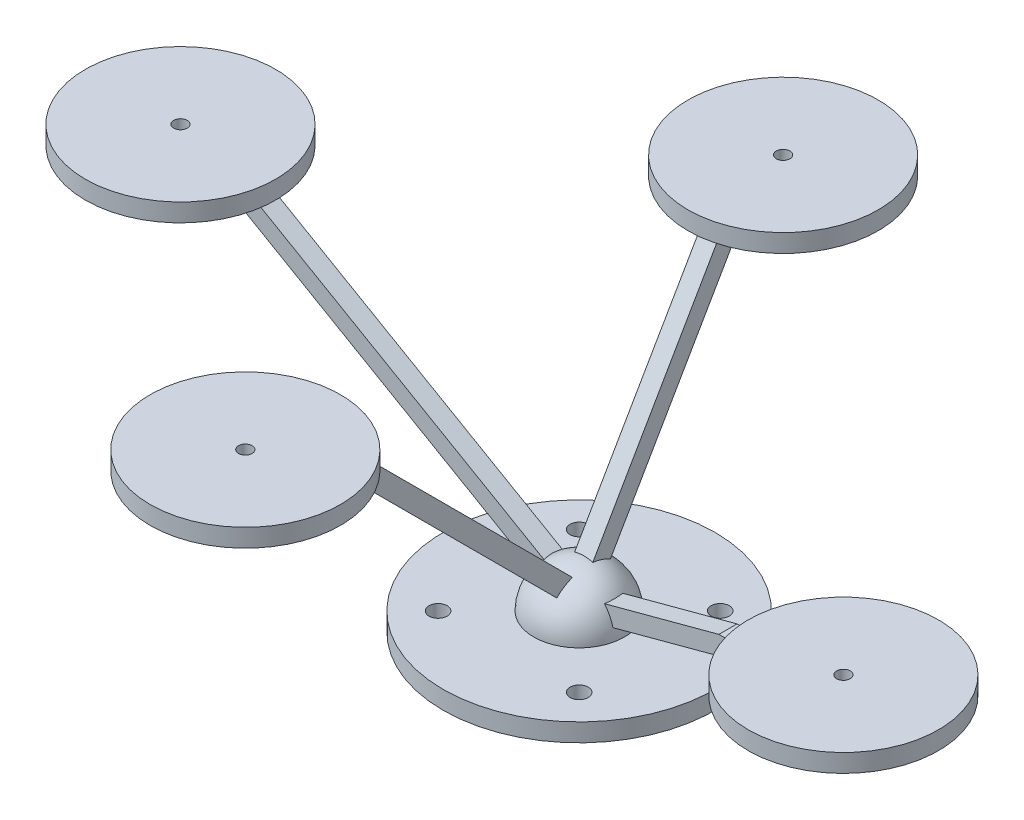
ISO-10303-21;
HEADER;
FILE_DESCRIPTION(('STEP AP214'),'2;1');
FILE_NAME('part.step','',(''),(''),'','','');
FILE_SCHEMA(('AUTOMOTIVE_DESIGN { 1 0 10303 214 1 1 1 1 }'));
ENDSEC;
DATA;
#1=APPLICATION_CONTEXT('core data for automotive mechanical design processes');
#2=APPLICATION_PROTOCOL_DEFINITION('international standard','automotive_design',2000,#1);
#3=PRODUCT_CONTEXT('',#1,'mechanical');
#4=PRODUCT('Part','Part','',(#3));
#5=PRODUCT_RELATED_PRODUCT_CATEGORY('part','',(#4));
#6=PRODUCT_DEFINITION_FORMATION('','',#4);
#7=PRODUCT_DEFINITION_CONTEXT('part definition',#1,'design');
#8=PRODUCT_DEFINITION('design','',#6,#7);
#9=PRODUCT_DEFINITION_SHAPE('','',#8);
#10=(LENGTH_UNIT() NAMED_UNIT(*) SI_UNIT(.MILLI.,.METRE.));
#11=(NAMED_UNIT(*) PLANE_ANGLE_UNIT() SI_UNIT($,.RADIAN.));
#12=(NAMED_UNIT(*) SI_UNIT($,.STERADIAN.) SOLID_ANGLE_UNIT());
#13=UNCERTAINTY_MEASURE_WITH_UNIT(LENGTH_MEASURE(1.E-05),#10,'distance_accuracy_value','');
#14=(GEOMETRIC_REPRESENTATION_CONTEXT(3) GLOBAL_UNCERTAINTY_ASSIGNED_CONTEXT((#13)) GLOBAL_UNIT_ASSIGNED_CONTEXT((#10,
#11,#12)) REPRESENTATION_CONTEXT('',''));
#15=CARTESIAN_POINT('',(0.,0.,0.));
#16=DIRECTION('',(0.,0.,1.));
#17=DIRECTION('',(1.,0.,0.));
#18=AXIS2_PLACEMENT_3D('',#15,#16,#17);
#19=CARTESIAN_POINT('',(0.,2.,0.));
#20=DIRECTION('',(0.,-1.,0.));
#21=DIRECTION('',(0.,0.,-1.));
#22=AXIS2_PLACEMENT_3D('',#19,#20,#21);
#23=SPHERICAL_SURFACE('',#22,5.);
#24=CARTESIAN_POINT('',(0.,2.,1.));
#25=DIRECTION('',(0.,0.,1.));
#26=DIRECTION('',(1.,0.,0.));
#27=AXIS2_PLACEMENT_3D('',#24,#25,#26);
#28=CIRCLE('',#27,4.89897948556636);
#29=CARTESIAN_POINT('',(-4.24264068711928,4.44948974278318,1.));
#30=VERTEX_POINT('',#29);
#31=CARTESIAN_POINT('',(-2.87298334620741,5.96811878506867,1.));
#32=VERTEX_POINT('',#31);
#33=EDGE_CURVE('E349',#30,#32,#28,.F.);
#34=ORIENTED_EDGE('',*,*,#33,.F.);
#35=CARTESIAN_POINT('',(0.,2.,0.));
#36=DIRECTION('',(0.500000000000001,0.866025403784438,0.));
#37=DIRECTION('',(-0.866025403784438,0.500000000000001,0.));
#38=AXIS2_PLACEMENT_3D('',#35,#36,#37);
#39=CIRCLE('',#38,5.);
#40=CARTESIAN_POINT('',(-4.24264068711928,4.44948974278318,-1.));
#41=VERTEX_POINT('',#40);
#42=EDGE_CURVE('E354',#30,#41,#39,.F.);
#43=ORIENTED_EDGE('',*,*,#42,.T.);
#44=CARTESIAN_POINT('',(0.,2.,-1.));
#45=DIRECTION('',(0.,0.,1.));
#46=DIRECTION('',(1.,0.,0.));
#47=AXIS2_PLACEMENT_3D('',#44,#45,#46);
#48=CIRCLE('',#47,4.89897948556636);
#49=CARTESIAN_POINT('',(-2.87298334620741,5.96811878506867,-1.));
#50=VERTEX_POINT('',#49);
#51=EDGE_CURVE('E338',#41,#50,#48,.F.);
#52=ORIENTED_EDGE('',*,*,#51,.T.);
#53=CARTESIAN_POINT('',(1.00000000000001,3.73205080756888,0.));
#54=DIRECTION('',(-0.500000000000001,-0.866025403784438,0.));
#55=DIRECTION('',(0.866025403784438,-0.500000000000001,0.));
#56=AXIS2_PLACEMENT_3D('',#53,#54,#55);
#57=CIRCLE('',#56,4.58257569495584);
#58=EDGE_CURVE('E350',#50,#32,#57,.F.);
#59=ORIENTED_EDGE('',*,*,#58,.T.);
#60=EDGE_LOOP('',(#34,#43,#52,#59));
#61=FACE_BOUND('',#60,.T.);
#62=CARTESIAN_POINT('',(3.802113527405,5.08932561001975,1.));
#63=VERTEX_POINT('',#62);
#64=CARTESIAN_POINT('',(4.73205080756889,3.26794919243109,1.));
#65=VERTEX_POINT('',#64);
#66=EDGE_CURVE('E346',#63,#65,#28,.F.);
#67=ORIENTED_EDGE('',*,*,#66,.F.);
#68=CARTESIAN_POINT('',(-0.517638090205028,3.93185165257814,0.));
#69=DIRECTION('',(0.258819045102515,-0.96592582628907,0.));
#70=DIRECTION('',(0.96592582628907,0.258819045102515,0.));
#71=AXIS2_PLACEMENT_3D('',#68,#69,#70);
#72=CIRCLE('',#71,4.58257569495584);
#73=CARTESIAN_POINT('',(3.802113527405,5.08932561001975,-1.));
#74=VERTEX_POINT('',#73);
#75=EDGE_CURVE('E337',#63,#74,#72,.F.);
#76=ORIENTED_EDGE('',*,*,#75,.T.);
#77=CARTESIAN_POINT('',(4.73205080756889,3.26794919243109,-1.));
#78=VERTEX_POINT('',#77);
#79=EDGE_CURVE('E333',#74,#78,#48,.F.);
#80=ORIENTED_EDGE('',*,*,#79,.T.);
#81=CARTESIAN_POINT('',(0.,2.,0.));
#82=DIRECTION('',(-0.258819045102514,0.96592582628907,0.));
#83=DIRECTION('',(-0.96592582628907,-0.258819045102514,0.));
#84=AXIS2_PLACEMENT_3D('',#81,#82,#83);
#85=CIRCLE('',#84,5.);
#86=EDGE_CURVE('E342',#78,#65,#85,.F.);
#87=ORIENTED_EDGE('',*,*,#86,.T.);
#88=EDGE_LOOP('',(#67,#76,#80,#87));
#89=FACE_BOUND('',#88,.T.);
#90=CARTESIAN_POINT('',(0.,2.,0.));
#91=DIRECTION('',(0.,1.,0.));
#92=DIRECTION('',(0.,0.,1.));
#93=AXIS2_PLACEMENT_3D('',#90,#91,#92);
#94=CIRCLE('',#93,5.);
#95=CARTESIAN_POINT('',(0.,2.,5.));
#96=VERTEX_POINT('',#95);
#97=EDGE_CURVE('E326',#96,#96,#94,.T.);
#98=ORIENTED_EDGE('',*,*,#97,.T.);
#99=EDGE_LOOP('',(#98));
#100=FACE_BOUND('',#99,.T.);
#101=CARTESIAN_POINT('',(0.,3.41421356237309,-1.4142135623731));
#102=DIRECTION('',(0.,-0.707106781186546,0.707106781186549));
#103=DIRECTION('',(0.,-0.707106781186549,-0.707106781186546));
#104=AXIS2_PLACEMENT_3D('',#101,#102,#103);
#105=CIRCLE('',#104,4.58257569495584);
#106=CARTESIAN_POINT('',(-1.,6.57649122254148,1.74806409779528));
#107=VERTEX_POINT('',#106);
#108=CARTESIAN_POINT('',(1.,6.57649122254148,1.74806409779528));
#109=VERTEX_POINT('',#108);
#110=EDGE_CURVE('E177',#107,#109,#105,.F.);
#111=ORIENTED_EDGE('',*,*,#110,.T.);
#112=CARTESIAN_POINT('',(1.,2.,0.));
#113=DIRECTION('',(-1.,0.,0.));
#114=DIRECTION('',(0.,0.,1.));
#115=AXIS2_PLACEMENT_3D('',#112,#113,#114);
#116=CIRCLE('',#115,4.89897948556636);
#117=CARTESIAN_POINT('',(1.,5.46410161513776,3.46410161513775));
#118=VERTEX_POINT('',#117);
#119=EDGE_CURVE('E50',#109,#118,#116,.F.);
#120=ORIENTED_EDGE('',*,*,#119,.T.);
#121=CARTESIAN_POINT('',(0.,2.,0.));
#122=DIRECTION('',(0.,0.707106781186546,-0.707106781186549));
#123=DIRECTION('',(0.,0.707106781186549,0.707106781186546));
#124=AXIS2_PLACEMENT_3D('',#121,#122,#123);
#125=CIRCLE('',#124,5.);
#126=CARTESIAN_POINT('',(-1.,5.46410161513776,3.46410161513775));
#127=VERTEX_POINT('',#126);
#128=EDGE_CURVE('E364',#118,#127,#125,.F.);
#129=ORIENTED_EDGE('',*,*,#128,.T.);
#130=CARTESIAN_POINT('',(-1.,2.,0.));
#131=DIRECTION('',(-1.,0.,0.));
#132=DIRECTION('',(0.,0.,1.));
#133=AXIS2_PLACEMENT_3D('',#130,#131,#132);
#134=CIRCLE('',#133,4.89897948556636);
#135=EDGE_CURVE('E358',#107,#127,#134,.F.);
#136=ORIENTED_EDGE('',*,*,#135,.F.);
#137=EDGE_LOOP('',(#111,#120,#129,#136));
#138=FACE_BOUND('',#137,.T.);
#139=CARTESIAN_POINT('',(0.,2.,0.));
#140=DIRECTION('',(0.,0.500000000000004,0.866025403784436));
#141=DIRECTION('',(0.,-0.866025403784436,0.500000000000004));
#142=AXIS2_PLACEMENT_3D('',#139,#140,#141);
#143=CIRCLE('',#142,5.);
#144=CARTESIAN_POINT('',(-1.,6.24264068711927,-2.4494897427832));
#145=VERTEX_POINT('',#144);
#146=CARTESIAN_POINT('',(1.,6.24264068711927,-2.4494897427832));
#147=VERTEX_POINT('',#146);
#148=EDGE_CURVE('E43',#145,#147,#143,.F.);
#149=ORIENTED_EDGE('',*,*,#148,.T.);
#150=CARTESIAN_POINT('',(1.,6.87298334620741,-0.504017169930936));
#151=VERTEX_POINT('',#150);
#152=EDGE_CURVE('E11',#147,#151,#116,.F.);
#153=ORIENTED_EDGE('',*,*,#152,.T.);
#154=CARTESIAN_POINT('',(0.,3.00000000000001,1.73205080756887));
#155=DIRECTION('',(0.,-0.500000000000004,-0.866025403784436));
#156=DIRECTION('',(0.,0.866025403784436,-0.500000000000004));
#157=AXIS2_PLACEMENT_3D('',#154,#155,#156);
#158=CIRCLE('',#157,4.58257569495584);
#159=CARTESIAN_POINT('',(-1.,6.87298334620742,-0.504017169930936));
#160=VERTEX_POINT('',#159);
#161=EDGE_CURVE('E367',#151,#160,#158,.F.);
#162=ORIENTED_EDGE('',*,*,#161,.T.);
#163=EDGE_CURVE('E361',#145,#160,#134,.F.);
#164=ORIENTED_EDGE('',*,*,#163,.F.);
#165=EDGE_LOOP('',(#149,#153,#162,#164));
#166=FACE_BOUND('',#165,.T.);
#167=ADVANCED_FACE('F39',(#61,#89,#100,#138,#166),#23,.T.);
#168=CARTESIAN_POINT('',(0.,2.,0.));
#169=DIRECTION('',(0.,1.,0.));
#170=DIRECTION('',(0.,0.,1.));
#171=AXIS2_PLACEMENT_3D('',#168,#169,#170);
#172=PLANE('',#171);
#173=ORIENTED_EDGE('',*,*,#97,.F.);
#174=EDGE_LOOP('',(#173));
#175=FACE_BOUND('',#174,.T.);
#176=CARTESIAN_POINT('',(-7.77817459305207,2.,7.77817459305198));
#177=DIRECTION('',(0.,1.,0.));
#178=DIRECTION('',(0.,0.,1.));
#179=AXIS2_PLACEMENT_3D('',#176,#177,#178);
#180=CIRCLE('',#179,1.);
#181=CARTESIAN_POINT('',(-7.77817459305207,2.,8.77817459305198));
#182=VERTEX_POINT('',#181);
#183=EDGE_CURVE('E298',#182,#182,#180,.T.);
#184=ORIENTED_EDGE('',*,*,#183,.F.);
#185=EDGE_LOOP('',(#184));
#186=FACE_BOUND('',#185,.T.);
#187=CARTESIAN_POINT('',(7.77817459305206,2.,-7.77817459305199));
#188=DIRECTION('',(0.,1.,0.));
#189=DIRECTION('',(0.,0.,1.));
#190=AXIS2_PLACEMENT_3D('',#187,#188,#189);
#191=CIRCLE('',#190,1.);
#192=CARTESIAN_POINT('',(7.77817459305206,2.,-6.77817459305198));
#193=VERTEX_POINT('',#192);
#194=EDGE_CURVE('E314',#193,#193,#191,.T.);
#195=ORIENTED_EDGE('',*,*,#194,.F.);
#196=EDGE_LOOP('',(#195));
#197=FACE_BOUND('',#196,.T.);
#198=CARTESIAN_POINT('',(0.,2.,0.));
#199=DIRECTION('',(0.,1.,0.));
#200=DIRECTION('',(0.,0.,1.));
#201=AXIS2_PLACEMENT_3D('',#198,#199,#200);
#202=CIRCLE('',#201,15.);
#203=CARTESIAN_POINT('',(0.,2.,15.));
#204=VERTEX_POINT('',#203);
#205=EDGE_CURVE('E322',#204,#204,#202,.T.);
#206=ORIENTED_EDGE('',*,*,#205,.T.);
#207=EDGE_LOOP('',(#206));
#208=FACE_BOUND('',#207,.T.);
#209=CARTESIAN_POINT('',(-7.77817459305204,2.,-7.77817459305201));
#210=DIRECTION('',(0.,1.,0.));
#211=DIRECTION('',(0.,0.,1.));
#212=AXIS2_PLACEMENT_3D('',#209,#210,#211);
#213=CIRCLE('',#212,0.999999999999995);
#214=CARTESIAN_POINT('',(-7.77817459305204,2.,-6.77817459305201));
#215=VERTEX_POINT('',#214);
#216=EDGE_CURVE('E306',#215,#215,#213,.T.);
#217=ORIENTED_EDGE('',*,*,#216,.F.);
#218=EDGE_LOOP('',(#217));
#219=FACE_BOUND('',#218,.T.);
#220=CARTESIAN_POINT('',(7.77817459305204,2.,7.77817459305201));
#221=DIRECTION('',(0.,1.,0.));
#222=DIRECTION('',(0.,0.,1.));
#223=AXIS2_PLACEMENT_3D('',#220,#221,#222);
#224=CIRCLE('',#223,1.);
#225=CARTESIAN_POINT('',(7.77817459305204,2.,8.77817459305201));
#226=VERTEX_POINT('',#225);
#227=EDGE_CURVE('E290',#226,#226,#224,.T.);
#228=ORIENTED_EDGE('',*,*,#227,.F.);
#229=EDGE_LOOP('',(#228));
#230=FACE_BOUND('',#229,.T.);
#231=ADVANCED_FACE('F464',(#175,#186,#197,#208,#219,#230),#172,.T.);
#232=CARTESIAN_POINT('',(0.,0.,0.));
#233=DIRECTION('',(0.,1.,0.));
#234=DIRECTION('',(0.,0.,1.));
#235=AXIS2_PLACEMENT_3D('',#232,#233,#234);
#236=PLANE('',#235);
#237=CARTESIAN_POINT('',(0.,0.,0.));
#238=DIRECTION('',(0.,1.,0.));
#239=DIRECTION('',(0.,0.,1.));
#240=AXIS2_PLACEMENT_3D('',#237,#238,#239);
#241=CIRCLE('',#240,15.);
#242=CARTESIAN_POINT('',(0.,0.,15.));
#243=VERTEX_POINT('',#242);
#244=EDGE_CURVE('E318',#243,#243,#241,.T.);
#245=ORIENTED_EDGE('',*,*,#244,.F.);
#246=EDGE_LOOP('',(#245));
#247=FACE_BOUND('',#246,.T.);
#248=CARTESIAN_POINT('',(7.77817459305206,0.,-7.77817459305199));
#249=DIRECTION('',(0.,1.,0.));
#250=DIRECTION('',(0.,0.,1.));
#251=AXIS2_PLACEMENT_3D('',#248,#249,#250);
#252=CIRCLE('',#251,1.);
#253=CARTESIAN_POINT('',(7.77817459305206,0.,-6.77817459305198));
#254=VERTEX_POINT('',#253);
#255=EDGE_CURVE('E310',#254,#254,#252,.T.);
#256=ORIENTED_EDGE('',*,*,#255,.T.);
#257=EDGE_LOOP('',(#256));
#258=FACE_BOUND('',#257,.T.);
#259=CARTESIAN_POINT('',(-7.77817459305204,0.,-7.77817459305201));
#260=DIRECTION('',(0.,1.,0.));
#261=DIRECTION('',(0.,0.,1.));
#262=AXIS2_PLACEMENT_3D('',#259,#260,#261);
#263=CIRCLE('',#262,0.999999999999995);
#264=CARTESIAN_POINT('',(-7.77817459305204,0.,-6.77817459305201));
#265=VERTEX_POINT('',#264);
#266=EDGE_CURVE('E302',#265,#265,#263,.T.);
#267=ORIENTED_EDGE('',*,*,#266,.T.);
#268=EDGE_LOOP('',(#267));
#269=FACE_BOUND('',#268,.T.);
#270=CARTESIAN_POINT('',(-7.77817459305207,0.,7.77817459305198));
#271=DIRECTION('',(0.,1.,0.));
#272=DIRECTION('',(0.,0.,1.));
#273=AXIS2_PLACEMENT_3D('',#270,#271,#272);
#274=CIRCLE('',#273,1.);
#275=CARTESIAN_POINT('',(-7.77817459305207,0.,8.77817459305198));
#276=VERTEX_POINT('',#275);
#277=EDGE_CURVE('E294',#276,#276,#274,.T.);
#278=ORIENTED_EDGE('',*,*,#277,.T.);
#279=EDGE_LOOP('',(#278));
#280=FACE_BOUND('',#279,.T.);
#281=CARTESIAN_POINT('',(7.77817459305204,0.,7.77817459305201));
#282=DIRECTION('',(0.,1.,0.));
#283=DIRECTION('',(0.,0.,1.));
#284=AXIS2_PLACEMENT_3D('',#281,#282,#283);
#285=CIRCLE('',#284,1.);
#286=CARTESIAN_POINT('',(7.77817459305204,0.,8.77817459305201));
#287=VERTEX_POINT('',#286);
#288=EDGE_CURVE('E289',#287,#287,#285,.T.);
#289=ORIENTED_EDGE('',*,*,#288,.T.);
#290=EDGE_LOOP('',(#289));
#291=FACE_BOUND('',#290,.T.);
#292=ADVANCED_FACE('F472',(#247,#258,#269,#280,#291),#236,.F.);
#293=CARTESIAN_POINT('',(0.,2.,0.));
#294=DIRECTION('',(0.,-1.,0.));
#295=DIRECTION('',(0.,0.,-1.));
#296=AXIS2_PLACEMENT_3D('',#293,#294,#295);
#297=CYLINDRICAL_SURFACE('',#296,15.);
#298=ORIENTED_EDGE('',*,*,#205,.F.);
#299=EDGE_LOOP('',(#298));
#300=FACE_BOUND('',#299,.T.);
#301=ORIENTED_EDGE('',*,*,#244,.T.);
#302=EDGE_LOOP('',(#301));
#303=FACE_BOUND('',#302,.T.);
#304=ADVANCED_FACE('F41',(#300,#303),#297,.T.);
#305=CARTESIAN_POINT('',(7.77817459305206,2.,-7.77817459305199));
#306=DIRECTION('',(0.,-1.,0.));
#307=DIRECTION('',(0.,0.,-1.));
#308=AXIS2_PLACEMENT_3D('',#305,#306,#307);
#309=CYLINDRICAL_SURFACE('',#308,1.);
#310=ORIENTED_EDGE('',*,*,#194,.T.);
#311=EDGE_LOOP('',(#310));
#312=FACE_BOUND('',#311,.T.);
#313=ORIENTED_EDGE('',*,*,#255,.F.);
#314=EDGE_LOOP('',(#313));
#315=FACE_BOUND('',#314,.T.);
#316=ADVANCED_FACE('F493',(#312,#315),#309,.F.);
#317=CARTESIAN_POINT('',(-7.77817459305204,2.,-7.77817459305201));
#318=DIRECTION('',(0.,-1.,0.));
#319=DIRECTION('',(0.,0.,-1.));
#320=AXIS2_PLACEMENT_3D('',#317,#318,#319);
#321=CYLINDRICAL_SURFACE('',#320,0.999999999999995);
#322=ORIENTED_EDGE('',*,*,#216,.T.);
#323=EDGE_LOOP('',(#322));
#324=FACE_BOUND('',#323,.T.);
#325=ORIENTED_EDGE('',*,*,#266,.F.);
#326=EDGE_LOOP('',(#325));
#327=FACE_BOUND('',#326,.T.);
#328=ADVANCED_FACE('F489',(#324,#327),#321,.F.);
#329=CARTESIAN_POINT('',(-7.77817459305207,2.,7.77817459305198));
#330=DIRECTION('',(0.,-1.,0.));
#331=DIRECTION('',(0.,0.,-1.));
#332=AXIS2_PLACEMENT_3D('',#329,#330,#331);
#333=CYLINDRICAL_SURFACE('',#332,1.);
#334=ORIENTED_EDGE('',*,*,#183,.T.);
#335=EDGE_LOOP('',(#334));
#336=FACE_BOUND('',#335,.T.);
#337=ORIENTED_EDGE('',*,*,#277,.F.);
#338=EDGE_LOOP('',(#337));
#339=FACE_BOUND('',#338,.T.);
#340=ADVANCED_FACE('F485',(#336,#339),#333,.F.);
#341=CARTESIAN_POINT('',(7.77817459305204,2.,7.77817459305201));
#342=DIRECTION('',(0.,-1.,0.));
#343=DIRECTION('',(0.,0.,-1.));
#344=AXIS2_PLACEMENT_3D('',#341,#342,#343);
#345=CYLINDRICAL_SURFACE('',#344,1.);
#346=ORIENTED_EDGE('',*,*,#227,.T.);
#347=EDGE_LOOP('',(#346));
#348=FACE_BOUND('',#347,.T.);
#349=ORIENTED_EDGE('',*,*,#288,.F.);
#350=EDGE_LOOP('',(#349));
#351=FACE_BOUND('',#350,.T.);
#352=ADVANCED_FACE('F481',(#348,#351),#345,.F.);
#353=CARTESIAN_POINT('',(16.420739046914,8.47047612756286,1.));
#354=DIRECTION('',(0.,-1.,0.));
#355=DIRECTION('',(1.,0.,0.));
#356=AXIS2_PLACEMENT_3D('',#353,#354,#355);
#357=PLANE('',#356);
#358=CARTESIAN_POINT('',(29.1481456572267,8.47047612756286,0.));
#359=DIRECTION('',(0.,1.,0.));
#360=DIRECTION('',(0.,0.,1.));
#361=AXIS2_PLACEMENT_3D('',#358,#359,#360);
#362=CIRCLE('',#361,10.5);
#363=CARTESIAN_POINT('',(18.6958731770433,8.47047612756285,-1.));
#364=VERTEX_POINT('',#363);
#365=CARTESIAN_POINT('',(18.6958731770433,8.47047612756286,1.));
#366=VERTEX_POINT('',#365);
#367=EDGE_CURVE('E226',#364,#366,#362,.T.);
#368=ORIENTED_EDGE('',*,*,#367,.F.);
#369=DIRECTION('',(-1.,0.,0.));
#370=VECTOR('',#369,1.);
#371=CARTESIAN_POINT('',(16.420739046914,8.47047612756286,-1.));
#372=LINE('',#371,#370);
#373=CARTESIAN_POINT('',(16.420739046914,8.47047612756286,-1.));
#374=VERTEX_POINT('',#373);
#375=EDGE_CURVE('E259',#364,#374,#372,.T.);
#376=ORIENTED_EDGE('',*,*,#375,.T.);
#377=DIRECTION('',(0.,0.,-1.));
#378=VECTOR('',#377,1.);
#379=CARTESIAN_POINT('',(16.420739046914,8.47047612756286,1.));
#380=LINE('',#379,#378);
#381=CARTESIAN_POINT('',(16.420739046914,8.47047612756286,1.));
#382=VERTEX_POINT('',#381);
#383=EDGE_CURVE('E281',#382,#374,#380,.T.);
#384=ORIENTED_EDGE('',*,*,#383,.F.);
#385=DIRECTION('',(-1.,0.,0.));
#386=VECTOR('',#385,1.);
#387=CARTESIAN_POINT('',(16.420739046914,8.47047612756286,1.));
#388=LINE('',#387,#386);
#389=EDGE_CURVE('E238',#366,#382,#388,.T.);
#390=ORIENTED_EDGE('',*,*,#389,.F.);
#391=EDGE_LOOP('',(#368,#376,#384,#390));
#392=FACE_BOUND('',#391,.T.);
#393=ADVANCED_FACE('F484',(#392),#357,.F.);
#394=CARTESIAN_POINT('',(0.,0.,-1.));
#395=DIRECTION('',(0.,0.,1.));
#396=DIRECTION('',(1.,0.,0.));
#397=AXIS2_PLACEMENT_3D('',#394,#395,#396);
#398=PLANE('',#397);
#399=ORIENTED_EDGE('',*,*,#79,.F.);
#400=DIRECTION('',(-0.96592582628907,-0.258819045102515,0.));
#401=VECTOR('',#400,1.);
#402=CARTESIAN_POINT('',(0.,4.07055236082016,-1.));
#403=LINE('',#402,#401);
#404=EDGE_CURVE('E264',#374,#74,#403,.T.);
#405=ORIENTED_EDGE('',*,*,#404,.F.);
#406=ORIENTED_EDGE('',*,*,#375,.F.);
#407=CARTESIAN_POINT('',(24.1481456572267,8.47047612756286,-1.));
#408=VERTEX_POINT('',#407);
#409=EDGE_CURVE('E260',#408,#364,#372,.T.);
#410=ORIENTED_EDGE('',*,*,#409,.F.);
#411=DIRECTION('',(0.96592582628907,0.258819045102514,0.));
#412=VECTOR('',#411,1.);
#413=CARTESIAN_POINT('',(0.,2.,-1.));
#414=LINE('',#413,#412);
#415=EDGE_CURVE('E256',#78,#408,#414,.T.);
#416=ORIENTED_EDGE('',*,*,#415,.F.);
#417=EDGE_LOOP('',(#399,#405,#406,#410,#416));
#418=FACE_BOUND('',#417,.T.);
#419=ADVANCED_FACE('F554',(#418),#398,.F.);
#420=CARTESIAN_POINT('',(0.,0.,1.));
#421=DIRECTION('',(0.,0.,1.));
#422=DIRECTION('',(1.,0.,0.));
#423=AXIS2_PLACEMENT_3D('',#420,#421,#422);
#424=PLANE('',#423);
#425=DIRECTION('',(-0.96592582628907,-0.258819045102515,0.));
#426=VECTOR('',#425,1.);
#427=CARTESIAN_POINT('',(0.,4.07055236082016,1.));
#428=LINE('',#427,#426);
#429=EDGE_CURVE('E242',#382,#63,#428,.T.);
#430=ORIENTED_EDGE('',*,*,#429,.T.);
#431=ORIENTED_EDGE('',*,*,#66,.T.);
#432=DIRECTION('',(0.96592582628907,0.258819045102514,0.));
#433=VECTOR('',#432,1.);
#434=CARTESIAN_POINT('',(0.,2.,1.));
#435=LINE('',#434,#433);
#436=CARTESIAN_POINT('',(24.1481456572267,8.47047612756286,1.));
#437=VERTEX_POINT('',#436);
#438=EDGE_CURVE('E234',#65,#437,#435,.T.);
#439=ORIENTED_EDGE('',*,*,#438,.T.);
#440=EDGE_CURVE('E239',#437,#366,#388,.T.);
#441=ORIENTED_EDGE('',*,*,#440,.T.);
#442=ORIENTED_EDGE('',*,*,#389,.T.);
#443=EDGE_LOOP('',(#430,#431,#439,#441,#442));
#444=FACE_BOUND('',#443,.T.);
#445=ADVANCED_FACE('F563',(#444),#424,.T.);
#446=CARTESIAN_POINT('',(0.,4.07055236082016,1.));
#447=DIRECTION('',(0.258819045102515,-0.96592582628907,0.));
#448=DIRECTION('',(0.96592582628907,0.258819045102515,0.));
#449=AXIS2_PLACEMENT_3D('',#446,#447,#448);
#450=PLANE('',#449);
#451=ORIENTED_EDGE('',*,*,#75,.F.);
#452=ORIENTED_EDGE('',*,*,#429,.F.);
#453=ORIENTED_EDGE('',*,*,#383,.T.);
#454=ORIENTED_EDGE('',*,*,#404,.T.);
#455=EDGE_LOOP('',(#451,#452,#453,#454));
#456=FACE_BOUND('',#455,.T.);
#457=ADVANCED_FACE('F572',(#456),#450,.F.);
#458=CARTESIAN_POINT('',(0.,2.,1.));
#459=DIRECTION('',(-0.258819045102514,0.96592582628907,0.));
#460=DIRECTION('',(-0.96592582628907,-0.258819045102514,0.));
#461=AXIS2_PLACEMENT_3D('',#458,#459,#460);
#462=PLANE('',#461);
#463=ORIENTED_EDGE('',*,*,#86,.F.);
#464=ORIENTED_EDGE('',*,*,#415,.T.);
#465=DIRECTION('',(0.,0.,-1.));
#466=VECTOR('',#465,1.);
#467=CARTESIAN_POINT('',(24.1481456572267,8.47047612756286,1.));
#468=LINE('',#467,#466);
#469=EDGE_CURVE('E285',#437,#408,#468,.T.);
#470=ORIENTED_EDGE('',*,*,#469,.F.);
#471=ORIENTED_EDGE('',*,*,#438,.F.);
#472=EDGE_LOOP('',(#463,#464,#470,#471));
#473=FACE_BOUND('',#472,.T.);
#474=ADVANCED_FACE('F581',(#473),#462,.F.);
#475=DIRECTION('',(0.866025403784438,-0.500000000000001,0.));
#476=VECTOR('',#475,1.);
#477=CARTESIAN_POINT('',(0.,2.,1.));
#478=LINE('',#477,#476);
#479=CARTESIAN_POINT('',(-38.9711431702997,24.5,1.));
#480=VERTEX_POINT('',#479);
#481=EDGE_CURVE('E230',#480,#30,#478,.T.);
#482=ORIENTED_EDGE('',*,*,#481,.T.);
#483=ORIENTED_EDGE('',*,*,#33,.T.);
#484=DIRECTION('',(-0.866025403784438,0.500000000000001,0.));
#485=VECTOR('',#484,1.);
#486=CARTESIAN_POINT('',(-34.9711431702997,24.5,1.));
#487=LINE('',#486,#485);
#488=CARTESIAN_POINT('',(-34.9711431702997,24.5,1.));
#489=VERTEX_POINT('',#488);
#490=EDGE_CURVE('E246',#32,#489,#487,.T.);
#491=ORIENTED_EDGE('',*,*,#490,.T.);
#492=DIRECTION('',(-1.,0.,0.));
#493=VECTOR('',#492,1.);
#494=CARTESIAN_POINT('',(-38.9711431702997,24.5,1.));
#495=LINE('',#494,#493);
#496=EDGE_CURVE('E249',#489,#480,#495,.T.);
#497=ORIENTED_EDGE('',*,*,#496,.T.);
#498=EDGE_LOOP('',(#482,#483,#491,#497));
#499=FACE_BOUND('',#498,.T.);
#500=ADVANCED_FACE('F575',(#499),#424,.T.);
#501=ORIENTED_EDGE('',*,*,#51,.F.);
#502=DIRECTION('',(0.866025403784438,-0.500000000000001,0.));
#503=VECTOR('',#502,1.);
#504=CARTESIAN_POINT('',(0.,2.,-1.));
#505=LINE('',#504,#503);
#506=CARTESIAN_POINT('',(-38.9711431702997,24.5,-1.));
#507=VERTEX_POINT('',#506);
#508=EDGE_CURVE('E225',#507,#41,#505,.T.);
#509=ORIENTED_EDGE('',*,*,#508,.F.);
#510=DIRECTION('',(-1.,0.,0.));
#511=VECTOR('',#510,1.);
#512=CARTESIAN_POINT('',(-38.9711431702997,24.5,-1.));
#513=LINE('',#512,#511);
#514=CARTESIAN_POINT('',(-34.9711431702997,24.5,-1.));
#515=VERTEX_POINT('',#514);
#516=EDGE_CURVE('E235',#515,#507,#513,.T.);
#517=ORIENTED_EDGE('',*,*,#516,.F.);
#518=DIRECTION('',(-0.866025403784438,0.500000000000001,0.));
#519=VECTOR('',#518,1.);
#520=CARTESIAN_POINT('',(-34.9711431702997,24.5,-1.));
#521=LINE('',#520,#519);
#522=EDGE_CURVE('E268',#50,#515,#521,.T.);
#523=ORIENTED_EDGE('',*,*,#522,.F.);
#524=EDGE_LOOP('',(#501,#509,#517,#523));
#525=FACE_BOUND('',#524,.T.);
#526=ADVANCED_FACE('F566',(#525),#398,.F.);
#527=CARTESIAN_POINT('',(0.,2.,1.));
#528=DIRECTION('',(0.500000000000001,0.866025403784438,0.));
#529=DIRECTION('',(-0.866025403784438,0.500000000000001,0.));
#530=AXIS2_PLACEMENT_3D('',#527,#528,#529);
#531=PLANE('',#530);
#532=ORIENTED_EDGE('',*,*,#42,.F.);
#533=ORIENTED_EDGE('',*,*,#481,.F.);
#534=DIRECTION('',(0.,0.,-1.));
#535=VECTOR('',#534,1.);
#536=CARTESIAN_POINT('',(-38.9711431702997,24.5,1.));
#537=LINE('',#536,#535);
#538=EDGE_CURVE('E252',#480,#507,#537,.T.);
#539=ORIENTED_EDGE('',*,*,#538,.T.);
#540=ORIENTED_EDGE('',*,*,#508,.T.);
#541=EDGE_LOOP('',(#532,#533,#539,#540));
#542=FACE_BOUND('',#541,.T.);
#543=ADVANCED_FACE('F479',(#542),#531,.F.);
#544=CARTESIAN_POINT('',(-34.9711431702997,24.5,1.));
#545=DIRECTION('',(-0.500000000000001,-0.866025403784438,0.));
#546=DIRECTION('',(0.866025403784438,-0.500000000000001,0.));
#547=AXIS2_PLACEMENT_3D('',#544,#545,#546);
#548=PLANE('',#547);
#549=ORIENTED_EDGE('',*,*,#58,.F.);
#550=ORIENTED_EDGE('',*,*,#522,.T.);
#551=DIRECTION('',(0.,0.,-1.));
#552=VECTOR('',#551,1.);
#553=CARTESIAN_POINT('',(-34.9711431702997,24.5,1.));
#554=LINE('',#553,#552);
#555=EDGE_CURVE('E277',#489,#515,#554,.T.);
#556=ORIENTED_EDGE('',*,*,#555,.F.);
#557=ORIENTED_EDGE('',*,*,#490,.F.);
#558=EDGE_LOOP('',(#549,#550,#556,#557));
#559=FACE_BOUND('',#558,.T.);
#560=ADVANCED_FACE('F608',(#559),#548,.F.);
#561=CARTESIAN_POINT('',(29.1481456572267,8.47047612756286,0.));
#562=DIRECTION('',(0.,1.,0.));
#563=DIRECTION('',(0.,0.,1.));
#564=AXIS2_PLACEMENT_3D('',#561,#562,#563);
#565=PLANE('',#564);
#566=CARTESIAN_POINT('',(29.1481456572267,8.47047612756286,0.));
#567=DIRECTION('',(0.,1.,0.));
#568=DIRECTION('',(0.,0.,1.));
#569=AXIS2_PLACEMENT_3D('',#566,#567,#568);
#570=CIRCLE('',#569,0.750000000000002);
#571=CARTESIAN_POINT('',(29.1481456572267,8.47047612756286,0.750000000000002));
#572=VERTEX_POINT('',#571);
#573=EDGE_CURVE('E209',#572,#572,#570,.T.);
#574=ORIENTED_EDGE('',*,*,#573,.T.);
#575=EDGE_LOOP('',(#574));
#576=FACE_BOUND('',#575,.T.);
#577=ORIENTED_EDGE('',*,*,#469,.T.);
#578=ORIENTED_EDGE('',*,*,#409,.T.);
#579=EDGE_CURVE('E217',#366,#364,#362,.T.);
#580=ORIENTED_EDGE('',*,*,#579,.F.);
#581=ORIENTED_EDGE('',*,*,#440,.F.);
#582=EDGE_LOOP('',(#577,#578,#580,#581));
#583=FACE_BOUND('',#582,.T.);
#584=ADVANCED_FACE('F615',(#576,#583),#565,.F.);
#585=CARTESIAN_POINT('',(29.1481456572267,10.4704761275629,0.));
#586=DIRECTION('',(0.,1.,0.));
#587=DIRECTION('',(0.,0.,1.));
#588=AXIS2_PLACEMENT_3D('',#585,#586,#587);
#589=PLANE('',#588);
#590=CARTESIAN_POINT('',(29.1481456572267,10.4704761275629,0.));
#591=DIRECTION('',(0.,1.,0.));
#592=DIRECTION('',(0.,0.,1.));
#593=AXIS2_PLACEMENT_3D('',#590,#591,#592);
#594=CIRCLE('',#593,10.5);
#595=CARTESIAN_POINT('',(29.1481456572267,10.4704761275629,10.5));
#596=VERTEX_POINT('',#595);
#597=EDGE_CURVE('E221',#596,#596,#594,.T.);
#598=ORIENTED_EDGE('',*,*,#597,.T.);
#599=EDGE_LOOP('',(#598));
#600=FACE_BOUND('',#599,.T.);
#601=CARTESIAN_POINT('',(29.1481456572267,10.4704761275629,0.));
#602=DIRECTION('',(0.,1.,0.));
#603=DIRECTION('',(0.,0.,1.));
#604=AXIS2_PLACEMENT_3D('',#601,#602,#603);
#605=CIRCLE('',#604,0.750000000000002);
#606=CARTESIAN_POINT('',(29.1481456572267,10.4704761275629,0.750000000000002));
#607=VERTEX_POINT('',#606);
#608=EDGE_CURVE('E213',#607,#607,#605,.T.);
#609=ORIENTED_EDGE('',*,*,#608,.F.);
#610=EDGE_LOOP('',(#609));
#611=FACE_BOUND('',#610,.T.);
#612=ADVANCED_FACE('F623',(#600,#611),#589,.T.);
#613=CARTESIAN_POINT('',(29.1481456572267,10.4704761275629,0.));
#614=DIRECTION('',(0.,-1.,0.));
#615=DIRECTION('',(0.,0.,-1.));
#616=AXIS2_PLACEMENT_3D('',#613,#614,#615);
#617=CYLINDRICAL_SURFACE('',#616,10.5);
#618=ORIENTED_EDGE('',*,*,#597,.F.);
#619=EDGE_LOOP('',(#618));
#620=FACE_BOUND('',#619,.T.);
#621=ORIENTED_EDGE('',*,*,#367,.T.);
#622=ORIENTED_EDGE('',*,*,#579,.T.);
#623=EDGE_LOOP('',(#621,#622));
#624=FACE_BOUND('',#623,.T.);
#625=ADVANCED_FACE('F631',(#620,#624),#617,.T.);
#626=CARTESIAN_POINT('',(29.1481456572267,10.4704761275629,0.));
#627=DIRECTION('',(0.,-1.,0.));
#628=DIRECTION('',(0.,0.,-1.));
#629=AXIS2_PLACEMENT_3D('',#626,#627,#628);
#630=CYLINDRICAL_SURFACE('',#629,0.750000000000002);
#631=ORIENTED_EDGE('',*,*,#608,.T.);
#632=EDGE_LOOP('',(#631));
#633=FACE_BOUND('',#632,.T.);
#634=ORIENTED_EDGE('',*,*,#573,.F.);
#635=EDGE_LOOP('',(#634));
#636=FACE_BOUND('',#635,.T.);
#637=ADVANCED_FACE('F639',(#633,#636),#630,.F.);
#638=CARTESIAN_POINT('',(-43.9711431702997,24.5000000000001,0.));
#639=DIRECTION('',(0.,1.,0.));
#640=DIRECTION('',(0.,0.,1.));
#641=AXIS2_PLACEMENT_3D('',#638,#639,#640);
#642=PLANE('',#641);
#643=CARTESIAN_POINT('',(-43.9711431702997,24.5000000000001,0.));
#644=DIRECTION('',(0.,1.,0.));
#645=DIRECTION('',(0.,0.,1.));
#646=AXIS2_PLACEMENT_3D('',#643,#644,#645);
#647=CIRCLE('',#646,10.5);
#648=CARTESIAN_POINT('',(-43.9711431702997,24.5000000000001,10.5));
#649=VERTEX_POINT('',#648);
#650=EDGE_CURVE('E201',#649,#649,#647,.T.);
#651=ORIENTED_EDGE('',*,*,#650,.F.);
#652=EDGE_LOOP('',(#651));
#653=FACE_BOUND('',#652,.T.);
#654=CARTESIAN_POINT('',(-43.9711431702997,24.5000000000001,0.));
#655=DIRECTION('',(0.,1.,0.));
#656=DIRECTION('',(0.,0.,1.));
#657=AXIS2_PLACEMENT_3D('',#654,#655,#656);
#658=CIRCLE('',#657,0.749999999999999);
#659=CARTESIAN_POINT('',(-43.9711431702997,24.5000000000001,0.749999999999999));
#660=VERTEX_POINT('',#659);
#661=EDGE_CURVE('E196',#660,#660,#658,.T.);
#662=ORIENTED_EDGE('',*,*,#661,.T.);
#663=EDGE_LOOP('',(#662));
#664=FACE_BOUND('',#663,.T.);
#665=ORIENTED_EDGE('',*,*,#555,.T.);
#666=ORIENTED_EDGE('',*,*,#516,.T.);
#667=ORIENTED_EDGE('',*,*,#538,.F.);
#668=ORIENTED_EDGE('',*,*,#496,.F.);
#669=EDGE_LOOP('',(#665,#666,#667,#668));
#670=FACE_BOUND('',#669,.T.);
#671=ADVANCED_FACE('F646',(#653,#664,#670),#642,.F.);
#672=CARTESIAN_POINT('',(-43.9711431702997,26.5000000000001,0.));
#673=DIRECTION('',(0.,1.,0.));
#674=DIRECTION('',(0.,0.,1.));
#675=AXIS2_PLACEMENT_3D('',#672,#673,#674);
#676=PLANE('',#675);
#677=CARTESIAN_POINT('',(-43.9711431702997,26.5000000000001,0.));
#678=DIRECTION('',(0.,1.,0.));
#679=DIRECTION('',(0.,0.,1.));
#680=AXIS2_PLACEMENT_3D('',#677,#678,#679);
#681=CIRCLE('',#680,10.5);
#682=CARTESIAN_POINT('',(-43.9711431702997,26.5000000000001,10.5));
#683=VERTEX_POINT('',#682);
#684=EDGE_CURVE('E205',#683,#683,#681,.T.);
#685=ORIENTED_EDGE('',*,*,#684,.T.);
#686=EDGE_LOOP('',(#685));
#687=FACE_BOUND('',#686,.T.);
#688=CARTESIAN_POINT('',(-43.9711431702997,26.5000000000001,0.));
#689=DIRECTION('',(0.,1.,0.));
#690=DIRECTION('',(0.,0.,1.));
#691=AXIS2_PLACEMENT_3D('',#688,#689,#690);
#692=CIRCLE('',#691,0.749999999999999);
#693=CARTESIAN_POINT('',(-43.9711431702997,26.5000000000001,0.749999999999999));
#694=VERTEX_POINT('',#693);
#695=EDGE_CURVE('E197',#694,#694,#692,.T.);
#696=ORIENTED_EDGE('',*,*,#695,.F.);
#697=EDGE_LOOP('',(#696));
#698=FACE_BOUND('',#697,.T.);
#699=ADVANCED_FACE('F653',(#687,#698),#676,.T.);
#700=CARTESIAN_POINT('',(-43.9711431702997,26.5000000000001,0.));
#701=DIRECTION('',(0.,-1.,0.));
#702=DIRECTION('',(0.,0.,-1.));
#703=AXIS2_PLACEMENT_3D('',#700,#701,#702);
#704=CYLINDRICAL_SURFACE('',#703,10.5);
#705=ORIENTED_EDGE('',*,*,#684,.F.);
#706=EDGE_LOOP('',(#705));
#707=FACE_BOUND('',#706,.T.);
#708=ORIENTED_EDGE('',*,*,#650,.T.);
#709=EDGE_LOOP('',(#708));
#710=FACE_BOUND('',#709,.T.);
#711=ADVANCED_FACE('F661',(#707,#710),#704,.T.);
#712=CARTESIAN_POINT('',(-43.9711431702997,26.5000000000001,0.));
#713=DIRECTION('',(0.,-1.,0.));
#714=DIRECTION('',(0.,0.,-1.));
#715=AXIS2_PLACEMENT_3D('',#712,#713,#714);
#716=CYLINDRICAL_SURFACE('',#715,0.749999999999999);
#717=ORIENTED_EDGE('',*,*,#695,.T.);
#718=EDGE_LOOP('',(#717));
#719=FACE_BOUND('',#718,.T.);
#720=ORIENTED_EDGE('',*,*,#661,.F.);
#721=EDGE_LOOP('',(#720));
#722=FACE_BOUND('',#721,.T.);
#723=ADVANCED_FACE('F669',(#719,#722),#716,.F.);
#724=CARTESIAN_POINT('',(1.,0.,0.));
#725=DIRECTION('',(-1.,0.,0.));
#726=DIRECTION('',(0.,0.,1.));
#727=AXIS2_PLACEMENT_3D('',#724,#725,#726);
#728=PLANE('',#727);
#729=ORIENTED_EDGE('',*,*,#119,.F.);
#730=DIRECTION('',(0.,0.707106781186549,0.707106781186546));
#731=VECTOR('',#730,1.);
#732=CARTESIAN_POINT('',(1.,4.82842712474619,0.));
#733=LINE('',#732,#731);
#734=CARTESIAN_POINT('',(1.,33.8198051533947,28.9913780286484));
#735=VERTEX_POINT('',#734);
#736=EDGE_CURVE('E398',#109,#735,#733,.T.);
#737=ORIENTED_EDGE('',*,*,#736,.T.);
#738=DIRECTION('',(0.,0.,1.));
#739=VECTOR('',#738,1.);
#740=CARTESIAN_POINT('',(1.,33.8198051533947,31.8198051533946));
#741=LINE('',#740,#739);
#742=CARTESIAN_POINT('',(1.,33.8198051533947,31.8198051533946));
#743=VERTEX_POINT('',#742);
#744=EDGE_CURVE('E182',#735,#743,#741,.T.);
#745=ORIENTED_EDGE('',*,*,#744,.T.);
#746=DIRECTION('',(0.,-0.707106781186548,-0.707106781186546));
#747=VECTOR('',#746,1.);
#748=CARTESIAN_POINT('',(1.,2.,0.));
#749=LINE('',#748,#747);
#750=EDGE_CURVE('E168',#743,#118,#749,.T.);
#751=ORIENTED_EDGE('',*,*,#750,.T.);
#752=EDGE_LOOP('',(#729,#737,#745,#751));
#753=FACE_BOUND('',#752,.T.);
#754=ADVANCED_FACE('F676',(#753),#728,.F.);
#755=CARTESIAN_POINT('',(-1.,0.,0.));
#756=DIRECTION('',(-1.,0.,0.));
#757=DIRECTION('',(0.,0.,1.));
#758=AXIS2_PLACEMENT_3D('',#755,#756,#757);
#759=PLANE('',#758);
#760=DIRECTION('',(0.,0.707106781186549,0.707106781186546));
#761=VECTOR('',#760,1.);
#762=CARTESIAN_POINT('',(-1.,4.82842712474619,0.));
#763=LINE('',#762,#761);
#764=CARTESIAN_POINT('',(-1.,33.8198051533947,28.9913780286484));
#765=VERTEX_POINT('',#764);
#766=EDGE_CURVE('E161',#107,#765,#763,.T.);
#767=ORIENTED_EDGE('',*,*,#766,.F.);
#768=ORIENTED_EDGE('',*,*,#135,.T.);
#769=DIRECTION('',(0.,-0.707106781186548,-0.707106781186546));
#770=VECTOR('',#769,1.);
#771=CARTESIAN_POINT('',(-1.,2.,0.));
#772=LINE('',#771,#770);
#773=CARTESIAN_POINT('',(-1.,33.8198051533947,31.8198051533946));
#774=VERTEX_POINT('',#773);
#775=EDGE_CURVE('E163',#774,#127,#772,.T.);
#776=ORIENTED_EDGE('',*,*,#775,.F.);
#777=DIRECTION('',(0.,0.,1.));
#778=VECTOR('',#777,1.);
#779=CARTESIAN_POINT('',(-1.,33.8198051533947,31.8198051533946));
#780=LINE('',#779,#778);
#781=EDGE_CURVE('E157',#765,#774,#780,.T.);
#782=ORIENTED_EDGE('',*,*,#781,.F.);
#783=EDGE_LOOP('',(#767,#768,#776,#782));
#784=FACE_BOUND('',#783,.T.);
#785=ADVANCED_FACE('F159',(#784),#759,.T.);
#786=CARTESIAN_POINT('',(1.,4.82842712474619,0.));
#787=DIRECTION('',(0.,-0.707106781186546,0.707106781186549));
#788=DIRECTION('',(0.,-0.707106781186549,-0.707106781186546));
#789=AXIS2_PLACEMENT_3D('',#786,#787,#788);
#790=PLANE('',#789);
#791=ORIENTED_EDGE('',*,*,#110,.F.);
#792=ORIENTED_EDGE('',*,*,#766,.T.);
#793=DIRECTION('',(-1.,0.,0.));
#794=VECTOR('',#793,1.);
#795=CARTESIAN_POINT('',(1.,33.8198051533947,28.9913780286484));
#796=LINE('',#795,#794);
#797=EDGE_CURVE('E175',#735,#765,#796,.T.);
#798=ORIENTED_EDGE('',*,*,#797,.F.);
#799=ORIENTED_EDGE('',*,*,#736,.F.);
#800=EDGE_LOOP('',(#791,#792,#798,#799));
#801=FACE_BOUND('',#800,.T.);
#802=ADVANCED_FACE('F173',(#801),#790,.F.);
#803=CARTESIAN_POINT('',(1.,2.,0.));
#804=DIRECTION('',(0.,0.707106781186546,-0.707106781186549));
#805=DIRECTION('',(0.,0.707106781186549,0.707106781186546));
#806=AXIS2_PLACEMENT_3D('',#803,#804,#805);
#807=PLANE('',#806);
#808=ORIENTED_EDGE('',*,*,#128,.F.);
#809=ORIENTED_EDGE('',*,*,#750,.F.);
#810=DIRECTION('',(-1.,0.,0.));
#811=VECTOR('',#810,1.);
#812=CARTESIAN_POINT('',(1.,33.8198051533947,31.8198051533946));
#813=LINE('',#812,#811);
#814=EDGE_CURVE('E185',#743,#774,#813,.T.);
#815=ORIENTED_EDGE('',*,*,#814,.T.);
#816=ORIENTED_EDGE('',*,*,#775,.T.);
#817=EDGE_LOOP('',(#808,#809,#815,#816));
#818=FACE_BOUND('',#817,.T.);
#819=ADVANCED_FACE('F697',(#818),#807,.F.);
#820=ORIENTED_EDGE('',*,*,#152,.F.);
#821=DIRECTION('',(0.,0.866025403784436,-0.500000000000004));
#822=VECTOR('',#821,1.);
#823=CARTESIAN_POINT('',(1.,2.,0.));
#824=LINE('',#823,#822);
#825=CARTESIAN_POINT('',(1.,32.3108891324553,-17.5000000000001));
#826=VERTEX_POINT('',#825);
#827=EDGE_CURVE('E407',#147,#826,#824,.T.);
#828=ORIENTED_EDGE('',*,*,#827,.T.);
#829=DIRECTION('',(0.,0.,1.));
#830=VECTOR('',#829,1.);
#831=CARTESIAN_POINT('',(1.,32.3108891324553,-15.1905989232416));
#832=LINE('',#831,#830);
#833=CARTESIAN_POINT('',(1.,32.3108891324553,-15.1905989232416));
#834=VERTEX_POINT('',#833);
#835=EDGE_CURVE('E404',#826,#834,#832,.T.);
#836=ORIENTED_EDGE('',*,*,#835,.T.);
#837=DIRECTION('',(0.,-0.866025403784436,0.500000000000004));
#838=VECTOR('',#837,1.);
#839=CARTESIAN_POINT('',(1.,5.99999999999997,0.));
#840=LINE('',#839,#838);
#841=EDGE_CURVE('E401',#834,#151,#840,.T.);
#842=ORIENTED_EDGE('',*,*,#841,.T.);
#843=EDGE_LOOP('',(#820,#828,#836,#842));
#844=FACE_BOUND('',#843,.T.);
#845=ADVANCED_FACE('F685',(#844),#728,.F.);
#846=DIRECTION('',(0.,0.866025403784436,-0.500000000000004));
#847=VECTOR('',#846,1.);
#848=CARTESIAN_POINT('',(-1.,2.,0.));
#849=LINE('',#848,#847);
#850=CARTESIAN_POINT('',(-1.,32.3108891324553,-17.5000000000001));
#851=VERTEX_POINT('',#850);
#852=EDGE_CURVE('E379',#145,#851,#849,.T.);
#853=ORIENTED_EDGE('',*,*,#852,.F.);
#854=ORIENTED_EDGE('',*,*,#163,.T.);
#855=DIRECTION('',(0.,-0.866025403784436,0.500000000000004));
#856=VECTOR('',#855,1.);
#857=CARTESIAN_POINT('',(-1.,5.99999999999997,0.));
#858=LINE('',#857,#856);
#859=CARTESIAN_POINT('',(-1.,32.3108891324553,-15.1905989232416));
#860=VERTEX_POINT('',#859);
#861=EDGE_CURVE('E179',#860,#160,#858,.T.);
#862=ORIENTED_EDGE('',*,*,#861,.F.);
#863=DIRECTION('',(0.,0.,1.));
#864=VECTOR('',#863,1.);
#865=CARTESIAN_POINT('',(-1.,32.3108891324553,-15.1905989232416));
#866=LINE('',#865,#864);
#867=EDGE_CURVE('E386',#851,#860,#866,.T.);
#868=ORIENTED_EDGE('',*,*,#867,.F.);
#869=EDGE_LOOP('',(#853,#854,#862,#868));
#870=FACE_BOUND('',#869,.T.);
#871=ADVANCED_FACE('F376',(#870),#759,.T.);
#872=CARTESIAN_POINT('',(1.,2.,0.));
#873=DIRECTION('',(0.,0.500000000000004,0.866025403784436));
#874=DIRECTION('',(0.,-0.866025403784436,0.500000000000004));
#875=AXIS2_PLACEMENT_3D('',#872,#873,#874);
#876=PLANE('',#875);
#877=ORIENTED_EDGE('',*,*,#148,.F.);
#878=ORIENTED_EDGE('',*,*,#852,.T.);
#879=DIRECTION('',(-1.,0.,0.));
#880=VECTOR('',#879,1.);
#881=CARTESIAN_POINT('',(1.,32.3108891324553,-17.5000000000001));
#882=LINE('',#881,#880);
#883=EDGE_CURVE('E189',#826,#851,#882,.T.);
#884=ORIENTED_EDGE('',*,*,#883,.F.);
#885=ORIENTED_EDGE('',*,*,#827,.F.);
#886=EDGE_LOOP('',(#877,#878,#884,#885));
#887=FACE_BOUND('',#886,.T.);
#888=ADVANCED_FACE('F717',(#887),#876,.F.);
#889=CARTESIAN_POINT('',(1.,5.99999999999997,0.));
#890=DIRECTION('',(0.,-0.500000000000004,-0.866025403784436));
#891=DIRECTION('',(0.,0.866025403784436,-0.500000000000004));
#892=AXIS2_PLACEMENT_3D('',#889,#890,#891);
#893=PLANE('',#892);
#894=ORIENTED_EDGE('',*,*,#161,.F.);
#895=ORIENTED_EDGE('',*,*,#841,.F.);
#896=DIRECTION('',(-1.,0.,0.));
#897=VECTOR('',#896,1.);
#898=CARTESIAN_POINT('',(1.,32.3108891324553,-15.1905989232416));
#899=LINE('',#898,#897);
#900=EDGE_CURVE('E184',#834,#860,#899,.T.);
#901=ORIENTED_EDGE('',*,*,#900,.T.);
#902=ORIENTED_EDGE('',*,*,#861,.T.);
#903=EDGE_LOOP('',(#894,#895,#901,#902));
#904=FACE_BOUND('',#903,.T.);
#905=ADVANCED_FACE('F381',(#904),#893,.F.);
#906=CARTESIAN_POINT('',(0.,32.3108891324553,-22.5000000000001));
#907=DIRECTION('',(0.,1.,0.));
#908=DIRECTION('',(0.,0.,1.));
#909=AXIS2_PLACEMENT_3D('',#906,#907,#908);
#910=PLANE('',#909);
#911=CARTESIAN_POINT('',(0.,32.3108891324553,-22.5000000000001));
#912=DIRECTION('',(0.,1.,0.));
#913=DIRECTION('',(0.,0.,1.));
#914=AXIS2_PLACEMENT_3D('',#911,#912,#913);
#915=CIRCLE('',#914,10.5);
#916=CARTESIAN_POINT('',(0.,32.3108891324553,-12.0000000000001));
#917=VERTEX_POINT('',#916);
#918=EDGE_CURVE('E413',#917,#917,#915,.T.);
#919=ORIENTED_EDGE('',*,*,#918,.F.);
#920=EDGE_LOOP('',(#919));
#921=FACE_BOUND('',#920,.T.);
#922=CARTESIAN_POINT('',(0.,32.3108891324553,-22.5000000000001));
#923=DIRECTION('',(0.,1.,0.));
#924=DIRECTION('',(0.,0.,1.));
#925=AXIS2_PLACEMENT_3D('',#922,#923,#924);
#926=CIRCLE('',#925,0.750000000000001);
#927=CARTESIAN_POINT('',(0.,32.3108891324553,-21.7500000000001));
#928=VERTEX_POINT('',#927);
#929=EDGE_CURVE('E421',#928,#928,#926,.T.);
#930=ORIENTED_EDGE('',*,*,#929,.T.);
#931=EDGE_LOOP('',(#930));
#932=FACE_BOUND('',#931,.T.);
#933=ORIENTED_EDGE('',*,*,#883,.T.);
#934=ORIENTED_EDGE('',*,*,#867,.T.);
#935=ORIENTED_EDGE('',*,*,#900,.F.);
#936=ORIENTED_EDGE('',*,*,#835,.F.);
#937=EDGE_LOOP('',(#933,#934,#935,#936));
#938=FACE_BOUND('',#937,.T.);
#939=ADVANCED_FACE('F730',(#921,#932,#938),#910,.F.);
#940=CARTESIAN_POINT('',(0.,34.3108891324553,-22.5000000000001));
#941=DIRECTION('',(0.,1.,0.));
#942=DIRECTION('',(0.,0.,1.));
#943=AXIS2_PLACEMENT_3D('',#940,#941,#942);
#944=PLANE('',#943);
#945=CARTESIAN_POINT('',(0.,34.3108891324553,-22.5000000000001));
#946=DIRECTION('',(0.,1.,0.));
#947=DIRECTION('',(0.,0.,1.));
#948=AXIS2_PLACEMENT_3D('',#945,#946,#947);
#949=CIRCLE('',#948,10.5);
#950=CARTESIAN_POINT('',(0.,34.3108891324553,-12.0000000000001));
#951=VERTEX_POINT('',#950);
#952=EDGE_CURVE('E395',#951,#951,#949,.T.);
#953=ORIENTED_EDGE('',*,*,#952,.T.);
#954=EDGE_LOOP('',(#953));
#955=FACE_BOUND('',#954,.T.);
#956=CARTESIAN_POINT('',(0.,34.3108891324553,-22.5000000000001));
#957=DIRECTION('',(0.,1.,0.));
#958=DIRECTION('',(0.,0.,1.));
#959=AXIS2_PLACEMENT_3D('',#956,#957,#958);
#960=CIRCLE('',#959,0.750000000000001);
#961=CARTESIAN_POINT('',(0.,34.3108891324553,-21.7500000000001));
#962=VERTEX_POINT('',#961);
#963=EDGE_CURVE('E417',#962,#962,#960,.T.);
#964=ORIENTED_EDGE('',*,*,#963,.F.);
#965=EDGE_LOOP('',(#964));
#966=FACE_BOUND('',#965,.T.);
#967=ADVANCED_FACE('F737',(#955,#966),#944,.T.);
#968=CARTESIAN_POINT('',(0.,34.3108891324553,-22.5000000000001));
#969=DIRECTION('',(0.,-1.,0.));
#970=DIRECTION('',(0.,0.,-1.));
#971=AXIS2_PLACEMENT_3D('',#968,#969,#970);
#972=CYLINDRICAL_SURFACE('',#971,10.5);
#973=ORIENTED_EDGE('',*,*,#952,.F.);
#974=EDGE_LOOP('',(#973));
#975=FACE_BOUND('',#974,.T.);
#976=ORIENTED_EDGE('',*,*,#918,.T.);
#977=EDGE_LOOP('',(#976));
#978=FACE_BOUND('',#977,.T.);
#979=ADVANCED_FACE('F745',(#975,#978),#972,.T.);
#980=CARTESIAN_POINT('',(0.,34.3108891324553,-22.5000000000001));
#981=DIRECTION('',(0.,-1.,0.));
#982=DIRECTION('',(0.,0.,-1.));
#983=AXIS2_PLACEMENT_3D('',#980,#981,#982);
#984=CYLINDRICAL_SURFACE('',#983,0.750000000000001);
#985=ORIENTED_EDGE('',*,*,#963,.T.);
#986=EDGE_LOOP('',(#985));
#987=FACE_BOUND('',#986,.T.);
#988=ORIENTED_EDGE('',*,*,#929,.F.);
#989=EDGE_LOOP('',(#988));
#990=FACE_BOUND('',#989,.T.);
#991=ADVANCED_FACE('F459',(#987,#990),#984,.F.);
#992=CARTESIAN_POINT('',(0.,33.8198051533947,36.8198051533946));
#993=DIRECTION('',(0.,1.,0.));
#994=DIRECTION('',(0.,0.,1.));
#995=AXIS2_PLACEMENT_3D('',#992,#993,#994);
#996=PLANE('',#995);
#997=CARTESIAN_POINT('',(0.,33.8198051533947,36.8198051533946));
#998=DIRECTION('',(0.,1.,0.));
#999=DIRECTION('',(0.,0.,1.));
#1000=AXIS2_PLACEMENT_3D('',#997,#998,#999);
#1001=CIRCLE('',#1000,10.5);
#1002=CARTESIAN_POINT('',(0.,33.8198051533947,47.3198051533946));
#1003=VERTEX_POINT('',#1002);
#1004=EDGE_CURVE('E429',#1003,#1003,#1001,.T.);
#1005=ORIENTED_EDGE('',*,*,#1004,.F.);
#1006=EDGE_LOOP('',(#1005));
#1007=FACE_BOUND('',#1006,.T.);
#1008=CARTESIAN_POINT('',(0.,33.8198051533947,36.8198051533946));
#1009=DIRECTION('',(0.,1.,0.));
#1010=DIRECTION('',(0.,0.,1.));
#1011=AXIS2_PLACEMENT_3D('',#1008,#1009,#1010);
#1012=CIRCLE('',#1011,0.750000000000001);
#1013=CARTESIAN_POINT('',(0.,33.8198051533947,37.5698051533946));
#1014=VERTEX_POINT('',#1013);
#1015=EDGE_CURVE('E437',#1014,#1014,#1012,.T.);
#1016=ORIENTED_EDGE('',*,*,#1015,.T.);
#1017=EDGE_LOOP('',(#1016));
#1018=FACE_BOUND('',#1017,.T.);
#1019=ORIENTED_EDGE('',*,*,#797,.T.);
#1020=ORIENTED_EDGE('',*,*,#781,.T.);
#1021=ORIENTED_EDGE('',*,*,#814,.F.);
#1022=ORIENTED_EDGE('',*,*,#744,.F.);
#1023=EDGE_LOOP('',(#1019,#1020,#1021,#1022));
#1024=FACE_BOUND('',#1023,.T.);
#1025=ADVANCED_FACE('F181',(#1007,#1018,#1024),#996,.F.);
#1026=CARTESIAN_POINT('',(0.,35.8198051533947,36.8198051533946));
#1027=DIRECTION('',(0.,1.,0.));
#1028=DIRECTION('',(0.,0.,1.));
#1029=AXIS2_PLACEMENT_3D('',#1026,#1027,#1028);
#1030=PLANE('',#1029);
#1031=CARTESIAN_POINT('',(0.,35.8198051533947,36.8198051533946));
#1032=DIRECTION('',(0.,1.,0.));
#1033=DIRECTION('',(0.,0.,1.));
#1034=AXIS2_PLACEMENT_3D('',#1031,#1032,#1033);
#1035=CIRCLE('',#1034,10.5);
#1036=CARTESIAN_POINT('',(0.,35.8198051533947,47.3198051533946));
#1037=VERTEX_POINT('',#1036);
#1038=EDGE_CURVE('E425',#1037,#1037,#1035,.T.);
#1039=ORIENTED_EDGE('',*,*,#1038,.T.);
#1040=EDGE_LOOP('',(#1039));
#1041=FACE_BOUND('',#1040,.T.);
#1042=CARTESIAN_POINT('',(0.,35.8198051533947,36.8198051533946));
#1043=DIRECTION('',(0.,1.,0.));
#1044=DIRECTION('',(0.,0.,1.));
#1045=AXIS2_PLACEMENT_3D('',#1042,#1043,#1044);
#1046=CIRCLE('',#1045,0.750000000000001);
#1047=CARTESIAN_POINT('',(0.,35.8198051533947,37.5698051533946));
#1048=VERTEX_POINT('',#1047);
#1049=EDGE_CURVE('E433',#1048,#1048,#1046,.T.);
#1050=ORIENTED_EDGE('',*,*,#1049,.F.);
#1051=EDGE_LOOP('',(#1050));
#1052=FACE_BOUND('',#1051,.T.);
#1053=ADVANCED_FACE('F448',(#1041,#1052),#1030,.T.);
#1054=CARTESIAN_POINT('',(0.,35.8198051533947,36.8198051533946));
#1055=DIRECTION('',(0.,-1.,0.));
#1056=DIRECTION('',(0.,0.,-1.));
#1057=AXIS2_PLACEMENT_3D('',#1054,#1055,#1056);
#1058=CYLINDRICAL_SURFACE('',#1057,10.5);
#1059=ORIENTED_EDGE('',*,*,#1038,.F.);
#1060=EDGE_LOOP('',(#1059));
#1061=FACE_BOUND('',#1060,.T.);
#1062=ORIENTED_EDGE('',*,*,#1004,.T.);
#1063=EDGE_LOOP('',(#1062));
#1064=FACE_BOUND('',#1063,.T.);
#1065=ADVANCED_FACE('F450',(#1061,#1064),#1058,.T.);
#1066=CARTESIAN_POINT('',(0.,35.8198051533947,36.8198051533946));
#1067=DIRECTION('',(0.,-1.,0.));
#1068=DIRECTION('',(0.,0.,-1.));
#1069=AXIS2_PLACEMENT_3D('',#1066,#1067,#1068);
#1070=CYLINDRICAL_SURFACE('',#1069,0.750000000000001);
#1071=ORIENTED_EDGE('',*,*,#1049,.T.);
#1072=EDGE_LOOP('',(#1071));
#1073=FACE_BOUND('',#1072,.T.);
#1074=ORIENTED_EDGE('',*,*,#1015,.F.);
#1075=EDGE_LOOP('',(#1074));
#1076=FACE_BOUND('',#1075,.T.);
#1077=ADVANCED_FACE('F445',(#1073,#1076),#1070,.F.);
#1078=CLOSED_SHELL('',(#167,#231,#292,#304,#316,#328,#340,#352,#393,#419,#445,#457,#474,#500,
#526,#543,#560,#584,#612,#625,#637,#671,#699,#711,#723,#754,#785,#802,#819,#845,#871,#888,#905,
#939,#967,#979,#991,#1025,#1053,#1065,#1077));
#1079=MANIFOLD_SOLID_BREP('B2',#1078);
#1080=ADVANCED_BREP_SHAPE_REPRESENTATION('',(#18,#1079),#14);
#1081=SHAPE_DEFINITION_REPRESENTATION(#9,#1080);
ENDSEC;
END-ISO-10303-21;
